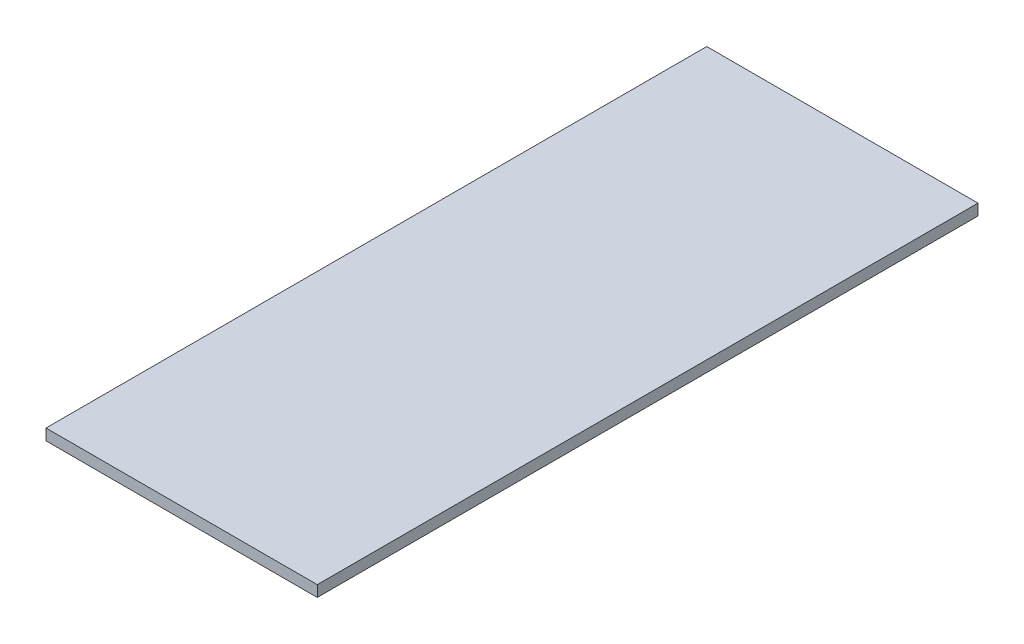
ISO-10303-21;
HEADER;
FILE_DESCRIPTION(('STEP AP214'),'2;1');
FILE_NAME('part.step','',(''),(''),'','','');
FILE_SCHEMA(('AUTOMOTIVE_DESIGN { 1 0 10303 214 1 1 1 1 }'));
ENDSEC;
DATA;
#1=APPLICATION_CONTEXT('core data for automotive mechanical design processes');
#2=APPLICATION_PROTOCOL_DEFINITION('international standard','automotive_design',2000,#1);
#3=PRODUCT_CONTEXT('',#1,'mechanical');
#4=PRODUCT('Part','Part','',(#3));
#5=PRODUCT_RELATED_PRODUCT_CATEGORY('part','',(#4));
#6=PRODUCT_DEFINITION_FORMATION('','',#4);
#7=PRODUCT_DEFINITION_CONTEXT('part definition',#1,'design');
#8=PRODUCT_DEFINITION('design','',#6,#7);
#9=PRODUCT_DEFINITION_SHAPE('','',#8);
#10=(LENGTH_UNIT() NAMED_UNIT(*) SI_UNIT(.MILLI.,.METRE.));
#11=(NAMED_UNIT(*) PLANE_ANGLE_UNIT() SI_UNIT($,.RADIAN.));
#12=(NAMED_UNIT(*) SI_UNIT($,.STERADIAN.) SOLID_ANGLE_UNIT());
#13=UNCERTAINTY_MEASURE_WITH_UNIT(LENGTH_MEASURE(1.E-05),#10,'distance_accuracy_value','');
#14=(GEOMETRIC_REPRESENTATION_CONTEXT(3) GLOBAL_UNCERTAINTY_ASSIGNED_CONTEXT((#13)) GLOBAL_UNIT_ASSIGNED_CONTEXT((#10,
#11,#12)) REPRESENTATION_CONTEXT('',''));
#15=CARTESIAN_POINT('',(0.,0.,0.));
#16=DIRECTION('',(0.,0.,1.));
#17=DIRECTION('',(1.,0.,0.));
#18=AXIS2_PLACEMENT_3D('',#15,#16,#17);
#19=CARTESIAN_POINT('',(0.,1.6,0.));
#20=DIRECTION('',(1.,0.,0.));
#21=DIRECTION('',(0.,0.,-1.));
#22=AXIS2_PLACEMENT_3D('',#19,#20,#21);
#23=PLANE('',#22);
#24=DIRECTION('',(0.,0.,1.));
#25=VECTOR('',#24,1.);
#26=CARTESIAN_POINT('',(0.,0.,0.));
#27=LINE('',#26,#25);
#28=CARTESIAN_POINT('',(0.,0.,-95.));
#29=VERTEX_POINT('',#28);
#30=CARTESIAN_POINT('',(0.,0.,0.));
#31=VERTEX_POINT('',#30);
#32=EDGE_CURVE('E107',#29,#31,#27,.T.);
#33=ORIENTED_EDGE('',*,*,#32,.T.);
#34=DIRECTION('',(0.,-1.,0.));
#35=VECTOR('',#34,1.);
#36=CARTESIAN_POINT('',(0.,1.6,0.));
#37=LINE('',#36,#35);
#38=CARTESIAN_POINT('',(0.,1.6,0.));
#39=VERTEX_POINT('',#38);
#40=EDGE_CURVE('E11',#39,#31,#37,.T.);
#41=ORIENTED_EDGE('',*,*,#40,.F.);
#42=DIRECTION('',(0.,0.,1.));
#43=VECTOR('',#42,1.);
#44=CARTESIAN_POINT('',(0.,1.6,0.));
#45=LINE('',#44,#43);
#46=CARTESIAN_POINT('',(0.,1.6,-95.));
#47=VERTEX_POINT('',#46);
#48=EDGE_CURVE('E91',#47,#39,#45,.T.);
#49=ORIENTED_EDGE('',*,*,#48,.F.);
#50=DIRECTION('',(0.,-1.,0.));
#51=VECTOR('',#50,1.);
#52=CARTESIAN_POINT('',(0.,1.6,-95.));
#53=LINE('',#52,#51);
#54=EDGE_CURVE('E103',#47,#29,#53,.T.);
#55=ORIENTED_EDGE('',*,*,#54,.T.);
#56=EDGE_LOOP('',(#33,#41,#49,#55));
#57=FACE_BOUND('',#56,.T.);
#58=ADVANCED_FACE('F39',(#57),#23,.F.);
#59=CARTESIAN_POINT('',(0.,1.6,0.));
#60=DIRECTION('',(0.,0.,-1.));
#61=DIRECTION('',(-1.,0.,0.));
#62=AXIS2_PLACEMENT_3D('',#59,#60,#61);
#63=PLANE('',#62);
#64=DIRECTION('',(1.,0.,0.));
#65=VECTOR('',#64,1.);
#66=CARTESIAN_POINT('',(0.,0.,0.));
#67=LINE('',#66,#65);
#68=CARTESIAN_POINT('',(39.,0.,0.));
#69=VERTEX_POINT('',#68);
#70=EDGE_CURVE('E96',#31,#69,#67,.T.);
#71=ORIENTED_EDGE('',*,*,#70,.T.);
#72=DIRECTION('',(0.,-1.,0.));
#73=VECTOR('',#72,1.);
#74=CARTESIAN_POINT('',(39.,1.6,0.));
#75=LINE('',#74,#73);
#76=CARTESIAN_POINT('',(39.,1.6,0.));
#77=VERTEX_POINT('',#76);
#78=EDGE_CURVE('E48',#77,#69,#75,.T.);
#79=ORIENTED_EDGE('',*,*,#78,.F.);
#80=DIRECTION('',(1.,0.,0.));
#81=VECTOR('',#80,1.);
#82=CARTESIAN_POINT('',(0.,1.6,0.));
#83=LINE('',#82,#81);
#84=EDGE_CURVE('E86',#39,#77,#83,.T.);
#85=ORIENTED_EDGE('',*,*,#84,.F.);
#86=ORIENTED_EDGE('',*,*,#40,.T.);
#87=EDGE_LOOP('',(#71,#79,#85,#86));
#88=FACE_BOUND('',#87,.T.);
#89=ADVANCED_FACE('F95',(#88),#63,.F.);
#90=CARTESIAN_POINT('',(39.,1.6,0.));
#91=DIRECTION('',(-1.,0.,0.));
#92=DIRECTION('',(0.,0.,1.));
#93=AXIS2_PLACEMENT_3D('',#90,#91,#92);
#94=PLANE('',#93);
#95=DIRECTION('',(0.,0.,-1.));
#96=VECTOR('',#95,1.);
#97=CARTESIAN_POINT('',(39.,0.,0.));
#98=LINE('',#97,#96);
#99=CARTESIAN_POINT('',(39.,0.,-95.));
#100=VERTEX_POINT('',#99);
#101=EDGE_CURVE('E73',#69,#100,#98,.T.);
#102=ORIENTED_EDGE('',*,*,#101,.T.);
#103=DIRECTION('',(0.,-1.,0.));
#104=VECTOR('',#103,1.);
#105=CARTESIAN_POINT('',(39.,1.6,-95.));
#106=LINE('',#105,#104);
#107=CARTESIAN_POINT('',(39.,1.6,-95.));
#108=VERTEX_POINT('',#107);
#109=EDGE_CURVE('E98',#108,#100,#106,.T.);
#110=ORIENTED_EDGE('',*,*,#109,.F.);
#111=DIRECTION('',(0.,0.,-1.));
#112=VECTOR('',#111,1.);
#113=CARTESIAN_POINT('',(39.,1.6,0.));
#114=LINE('',#113,#112);
#115=EDGE_CURVE('E89',#77,#108,#114,.T.);
#116=ORIENTED_EDGE('',*,*,#115,.F.);
#117=ORIENTED_EDGE('',*,*,#78,.T.);
#118=EDGE_LOOP('',(#102,#110,#116,#117));
#119=FACE_BOUND('',#118,.T.);
#120=ADVANCED_FACE('F99',(#119),#94,.F.);
#121=CARTESIAN_POINT('',(0.,1.6,-95.));
#122=DIRECTION('',(0.,0.,1.));
#123=DIRECTION('',(1.,0.,0.));
#124=AXIS2_PLACEMENT_3D('',#121,#122,#123);
#125=PLANE('',#124);
#126=DIRECTION('',(-1.,0.,0.));
#127=VECTOR('',#126,1.);
#128=CARTESIAN_POINT('',(0.,0.,-95.));
#129=LINE('',#128,#127);
#130=EDGE_CURVE('E79',#100,#29,#129,.T.);
#131=ORIENTED_EDGE('',*,*,#130,.T.);
#132=ORIENTED_EDGE('',*,*,#54,.F.);
#133=DIRECTION('',(-1.,0.,0.));
#134=VECTOR('',#133,1.);
#135=CARTESIAN_POINT('',(0.,1.6,-95.));
#136=LINE('',#135,#134);
#137=EDGE_CURVE('E56',#108,#47,#136,.T.);
#138=ORIENTED_EDGE('',*,*,#137,.F.);
#139=ORIENTED_EDGE('',*,*,#109,.T.);
#140=EDGE_LOOP('',(#131,#132,#138,#139));
#141=FACE_BOUND('',#140,.T.);
#142=ADVANCED_FACE('F120',(#141),#125,.F.);
#143=CARTESIAN_POINT('',(0.,1.6,0.));
#144=DIRECTION('',(0.,-1.,0.));
#145=DIRECTION('',(0.,0.,-1.));
#146=AXIS2_PLACEMENT_3D('',#143,#144,#145);
#147=PLANE('',#146);
#148=ORIENTED_EDGE('',*,*,#48,.T.);
#149=ORIENTED_EDGE('',*,*,#84,.T.);
#150=ORIENTED_EDGE('',*,*,#115,.T.);
#151=ORIENTED_EDGE('',*,*,#137,.T.);
#152=EDGE_LOOP('',(#148,#149,#150,#151));
#153=FACE_BOUND('',#152,.T.);
#154=ADVANCED_FACE('F87',(#153),#147,.F.);
#155=CARTESIAN_POINT('',(0.,0.,0.));
#156=DIRECTION('',(0.,-1.,0.));
#157=DIRECTION('',(0.,0.,-1.));
#158=AXIS2_PLACEMENT_3D('',#155,#156,#157);
#159=PLANE('',#158);
#160=ORIENTED_EDGE('',*,*,#32,.F.);
#161=ORIENTED_EDGE('',*,*,#130,.F.);
#162=ORIENTED_EDGE('',*,*,#101,.F.);
#163=ORIENTED_EDGE('',*,*,#70,.F.);
#164=EDGE_LOOP('',(#160,#161,#162,#163));
#165=FACE_BOUND('',#164,.T.);
#166=ADVANCED_FACE('F123',(#165),#159,.T.);
#167=CLOSED_SHELL('',(#58,#89,#120,#142,#154,#166));
#168=MANIFOLD_SOLID_BREP('B2',#167);
#169=ADVANCED_BREP_SHAPE_REPRESENTATION('',(#18,#168),#14);
#170=SHAPE_DEFINITION_REPRESENTATION(#9,#169);
ENDSEC;
END-ISO-10303-21;
